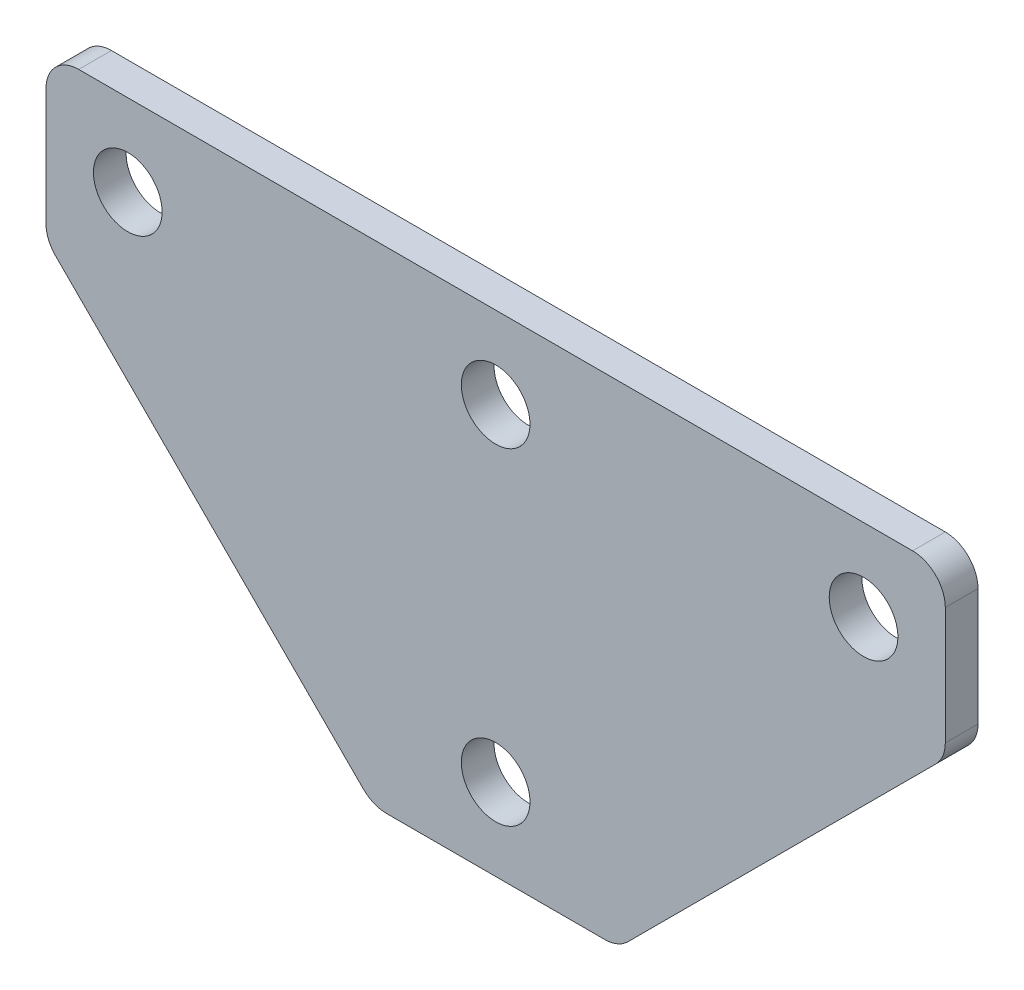
ISO-10303-21;
HEADER;
FILE_DESCRIPTION(('STEP AP214'),'2;1');
FILE_NAME('part.step','',(''),(''),'','','');
FILE_SCHEMA(('AUTOMOTIVE_DESIGN { 1 0 10303 214 1 1 1 1 }'));
ENDSEC;
DATA;
#1=APPLICATION_CONTEXT('core data for automotive mechanical design processes');
#2=APPLICATION_PROTOCOL_DEFINITION('international standard','automotive_design',2000,#1);
#3=PRODUCT_CONTEXT('',#1,'mechanical');
#4=PRODUCT('Part','Part','',(#3));
#5=PRODUCT_RELATED_PRODUCT_CATEGORY('part','',(#4));
#6=PRODUCT_DEFINITION_FORMATION('','',#4);
#7=PRODUCT_DEFINITION_CONTEXT('part definition',#1,'design');
#8=PRODUCT_DEFINITION('design','',#6,#7);
#9=PRODUCT_DEFINITION_SHAPE('','',#8);
#10=(LENGTH_UNIT() NAMED_UNIT(*) SI_UNIT(.MILLI.,.METRE.));
#11=(NAMED_UNIT(*) PLANE_ANGLE_UNIT() SI_UNIT($,.RADIAN.));
#12=(NAMED_UNIT(*) SI_UNIT($,.STERADIAN.) SOLID_ANGLE_UNIT());
#13=UNCERTAINTY_MEASURE_WITH_UNIT(LENGTH_MEASURE(1.E-05),#10,'distance_accuracy_value','');
#14=(GEOMETRIC_REPRESENTATION_CONTEXT(3) GLOBAL_UNCERTAINTY_ASSIGNED_CONTEXT((#13)) GLOBAL_UNIT_ASSIGNED_CONTEXT((#10,
#11,#12)) REPRESENTATION_CONTEXT('',''));
#15=CARTESIAN_POINT('',(0.,0.,0.));
#16=DIRECTION('',(0.,0.,1.));
#17=DIRECTION('',(1.,0.,0.));
#18=AXIS2_PLACEMENT_3D('',#15,#16,#17);
#19=CARTESIAN_POINT('',(0.,0.,2.));
#20=DIRECTION('',(0.,0.,1.));
#21=DIRECTION('',(1.,0.,0.));
#22=AXIS2_PLACEMENT_3D('',#19,#20,#21);
#23=PLANE('',#22);
#24=CARTESIAN_POINT('',(7.5,25.,2.));
#25=DIRECTION('',(0.,0.,1.));
#26=DIRECTION('',(1.,0.,0.));
#27=AXIS2_PLACEMENT_3D('',#24,#25,#26);
#28=CIRCLE('',#27,2.1);
#29=CARTESIAN_POINT('',(9.6,25.,2.));
#30=VERTEX_POINT('',#29);
#31=EDGE_CURVE('E250',#30,#30,#28,.T.);
#32=ORIENTED_EDGE('',*,*,#31,.F.);
#33=EDGE_LOOP('',(#32));
#34=FACE_BOUND('',#33,.T.);
#35=CARTESIAN_POINT('',(-15.,25.,2.));
#36=DIRECTION('',(0.,0.,1.));
#37=DIRECTION('',(1.,0.,0.));
#38=AXIS2_PLACEMENT_3D('',#35,#36,#37);
#39=CIRCLE('',#38,2.1);
#40=CARTESIAN_POINT('',(-12.9,25.,2.));
#41=VERTEX_POINT('',#40);
#42=EDGE_CURVE('E157',#41,#41,#39,.T.);
#43=ORIENTED_EDGE('',*,*,#42,.F.);
#44=EDGE_LOOP('',(#43));
#45=FACE_BOUND('',#44,.T.);
#46=DIRECTION('',(0.707106781186548,-0.707106781186547,0.));
#47=VECTOR('',#46,1.);
#48=CARTESIAN_POINT('',(-20.,20.,2.));
#49=LINE('',#48,#47);
#50=CARTESIAN_POINT('',(-19.4142135623731,19.4142135623731,2.));
#51=VERTEX_POINT('',#50);
#52=CARTESIAN_POINT('',(-0.585786437626905,0.585786437626905,2.));
#53=VERTEX_POINT('',#52);
#54=EDGE_CURVE('E168',#51,#53,#49,.T.);
#55=ORIENTED_EDGE('',*,*,#54,.T.);
#56=CARTESIAN_POINT('',(0.828427124746185,2.,2.));
#57=DIRECTION('',(0.,0.,1.));
#58=DIRECTION('',(1.,0.,0.));
#59=AXIS2_PLACEMENT_3D('',#56,#57,#58);
#60=CIRCLE('',#59,2.);
#61=CARTESIAN_POINT('',(0.828427124746185,0.,2.));
#62=VERTEX_POINT('',#61);
#63=EDGE_CURVE('E191',#53,#62,#60,.T.);
#64=ORIENTED_EDGE('',*,*,#63,.T.);
#65=DIRECTION('',(1.,0.,0.));
#66=VECTOR('',#65,1.);
#67=CARTESIAN_POINT('',(0.,0.,2.));
#68=LINE('',#67,#66);
#69=CARTESIAN_POINT('',(14.1715728752538,0.,2.));
#70=VERTEX_POINT('',#69);
#71=EDGE_CURVE('E144',#62,#70,#68,.T.);
#72=ORIENTED_EDGE('',*,*,#71,.T.);
#73=CARTESIAN_POINT('',(14.1715728752538,2.,2.));
#74=DIRECTION('',(0.,0.,1.));
#75=DIRECTION('',(1.,0.,0.));
#76=AXIS2_PLACEMENT_3D('',#73,#74,#75);
#77=CIRCLE('',#76,2.);
#78=CARTESIAN_POINT('',(15.5857864376269,0.585786437626906,2.));
#79=VERTEX_POINT('',#78);
#80=EDGE_CURVE('E189',#70,#79,#77,.T.);
#81=ORIENTED_EDGE('',*,*,#80,.T.);
#82=DIRECTION('',(0.707106781186548,0.707106781186547,0.));
#83=VECTOR('',#82,1.);
#84=CARTESIAN_POINT('',(15.,0.,2.));
#85=LINE('',#84,#83);
#86=CARTESIAN_POINT('',(34.4142135623731,19.4142135623731,2.));
#87=VERTEX_POINT('',#86);
#88=EDGE_CURVE('E222',#79,#87,#85,.T.);
#89=ORIENTED_EDGE('',*,*,#88,.T.);
#90=CARTESIAN_POINT('',(33.,20.8284271247462,2.));
#91=DIRECTION('',(0.,0.,1.));
#92=DIRECTION('',(1.,0.,0.));
#93=AXIS2_PLACEMENT_3D('',#90,#91,#92);
#94=CIRCLE('',#93,2.);
#95=CARTESIAN_POINT('',(35.,20.8284271247462,2.));
#96=VERTEX_POINT('',#95);
#97=EDGE_CURVE('E187',#87,#96,#94,.T.);
#98=ORIENTED_EDGE('',*,*,#97,.T.);
#99=DIRECTION('',(0.,1.,0.));
#100=VECTOR('',#99,1.);
#101=CARTESIAN_POINT('',(35.,20.,2.));
#102=LINE('',#101,#100);
#103=CARTESIAN_POINT('',(35.,28.,2.));
#104=VERTEX_POINT('',#103);
#105=EDGE_CURVE('E230',#96,#104,#102,.T.);
#106=ORIENTED_EDGE('',*,*,#105,.T.);
#107=CARTESIAN_POINT('',(33.,28.,2.));
#108=DIRECTION('',(0.,0.,1.));
#109=DIRECTION('',(1.,0.,0.));
#110=AXIS2_PLACEMENT_3D('',#107,#108,#109);
#111=CIRCLE('',#110,2.);
#112=CARTESIAN_POINT('',(33.,30.,2.));
#113=VERTEX_POINT('',#112);
#114=EDGE_CURVE('E185',#104,#113,#111,.T.);
#115=ORIENTED_EDGE('',*,*,#114,.T.);
#116=DIRECTION('',(-1.,0.,0.));
#117=VECTOR('',#116,1.);
#118=CARTESIAN_POINT('',(35.,30.,2.));
#119=LINE('',#118,#117);
#120=CARTESIAN_POINT('',(-18.,30.,2.));
#121=VERTEX_POINT('',#120);
#122=EDGE_CURVE('E233',#113,#121,#119,.T.);
#123=ORIENTED_EDGE('',*,*,#122,.T.);
#124=CARTESIAN_POINT('',(-18.,28.,2.));
#125=DIRECTION('',(0.,0.,1.));
#126=DIRECTION('',(1.,0.,0.));
#127=AXIS2_PLACEMENT_3D('',#124,#125,#126);
#128=CIRCLE('',#127,2.);
#129=CARTESIAN_POINT('',(-20.,28.,2.));
#130=VERTEX_POINT('',#129);
#131=EDGE_CURVE('E55',#121,#130,#128,.T.);
#132=ORIENTED_EDGE('',*,*,#131,.T.);
#133=DIRECTION('',(0.,-1.,0.));
#134=VECTOR('',#133,1.);
#135=CARTESIAN_POINT('',(-20.,30.,2.));
#136=LINE('',#135,#134);
#137=CARTESIAN_POINT('',(-20.,20.8284271247462,2.));
#138=VERTEX_POINT('',#137);
#139=EDGE_CURVE('E169',#130,#138,#136,.T.);
#140=ORIENTED_EDGE('',*,*,#139,.T.);
#141=CARTESIAN_POINT('',(-18.,20.8284271247462,2.));
#142=DIRECTION('',(0.,0.,1.));
#143=DIRECTION('',(1.,0.,0.));
#144=AXIS2_PLACEMENT_3D('',#141,#142,#143);
#145=CIRCLE('',#144,2.);
#146=EDGE_CURVE('E183',#138,#51,#145,.T.);
#147=ORIENTED_EDGE('',*,*,#146,.T.);
#148=EDGE_LOOP('',(#55,#64,#72,#81,#89,#98,#106,#115,#123,#132,#140,#147));
#149=FACE_BOUND('',#148,.T.);
#150=CARTESIAN_POINT('',(30.,25.,2.));
#151=DIRECTION('',(0.,0.,1.));
#152=DIRECTION('',(-1.,0.,0.));
#153=AXIS2_PLACEMENT_3D('',#150,#151,#152);
#154=CIRCLE('',#153,2.1);
#155=CARTESIAN_POINT('',(27.9,25.,2.));
#156=VERTEX_POINT('',#155);
#157=EDGE_CURVE('E241',#156,#156,#154,.T.);
#158=ORIENTED_EDGE('',*,*,#157,.F.);
#159=EDGE_LOOP('',(#158));
#160=FACE_BOUND('',#159,.T.);
#161=CARTESIAN_POINT('',(7.5,5.,2.));
#162=DIRECTION('',(0.,0.,1.));
#163=DIRECTION('',(1.,0.,0.));
#164=AXIS2_PLACEMENT_3D('',#161,#162,#163);
#165=CIRCLE('',#164,2.1);
#166=CARTESIAN_POINT('',(9.6,5.,2.));
#167=VERTEX_POINT('',#166);
#168=EDGE_CURVE('E244',#167,#167,#165,.T.);
#169=ORIENTED_EDGE('',*,*,#168,.F.);
#170=EDGE_LOOP('',(#169));
#171=FACE_BOUND('',#170,.T.);
#172=ADVANCED_FACE('F35',(#34,#45,#149,#160,#171),#23,.T.);
#173=CARTESIAN_POINT('',(0.,0.,0.));
#174=DIRECTION('',(0.,0.,1.));
#175=DIRECTION('',(1.,0.,0.));
#176=AXIS2_PLACEMENT_3D('',#173,#174,#175);
#177=PLANE('',#176);
#178=DIRECTION('',(1.,0.,0.));
#179=VECTOR('',#178,1.);
#180=CARTESIAN_POINT('',(0.,0.,0.));
#181=LINE('',#180,#179);
#182=CARTESIAN_POINT('',(0.828427124746185,0.,0.));
#183=VERTEX_POINT('',#182);
#184=CARTESIAN_POINT('',(14.1715728752538,0.,0.));
#185=VERTEX_POINT('',#184);
#186=EDGE_CURVE('E141',#183,#185,#181,.T.);
#187=ORIENTED_EDGE('',*,*,#186,.F.);
#188=CARTESIAN_POINT('',(0.828427124746185,2.,0.));
#189=DIRECTION('',(0.,0.,1.));
#190=DIRECTION('',(1.,0.,0.));
#191=AXIS2_PLACEMENT_3D('',#188,#189,#190);
#192=CIRCLE('',#191,2.);
#193=CARTESIAN_POINT('',(-0.585786437626905,0.585786437626905,0.));
#194=VERTEX_POINT('',#193);
#195=EDGE_CURVE('E124',#183,#194,#192,.F.);
#196=ORIENTED_EDGE('',*,*,#195,.T.);
#197=DIRECTION('',(0.707106781186548,-0.707106781186547,0.));
#198=VECTOR('',#197,1.);
#199=CARTESIAN_POINT('',(-20.,20.,0.));
#200=LINE('',#199,#198);
#201=CARTESIAN_POINT('',(-19.4142135623731,19.4142135623731,0.));
#202=VERTEX_POINT('',#201);
#203=EDGE_CURVE('E152',#202,#194,#200,.T.);
#204=ORIENTED_EDGE('',*,*,#203,.F.);
#205=CARTESIAN_POINT('',(-18.,20.8284271247462,0.));
#206=DIRECTION('',(0.,0.,1.));
#207=DIRECTION('',(1.,0.,0.));
#208=AXIS2_PLACEMENT_3D('',#205,#206,#207);
#209=CIRCLE('',#208,2.);
#210=CARTESIAN_POINT('',(-20.,20.8284271247462,0.));
#211=VERTEX_POINT('',#210);
#212=EDGE_CURVE('E172',#202,#211,#209,.F.);
#213=ORIENTED_EDGE('',*,*,#212,.T.);
#214=DIRECTION('',(0.,-1.,0.));
#215=VECTOR('',#214,1.);
#216=CARTESIAN_POINT('',(-20.,30.,0.));
#217=LINE('',#216,#215);
#218=CARTESIAN_POINT('',(-20.,28.,0.));
#219=VERTEX_POINT('',#218);
#220=EDGE_CURVE('E166',#219,#211,#217,.T.);
#221=ORIENTED_EDGE('',*,*,#220,.F.);
#222=CARTESIAN_POINT('',(-18.,28.,0.));
#223=DIRECTION('',(0.,0.,1.));
#224=DIRECTION('',(1.,0.,0.));
#225=AXIS2_PLACEMENT_3D('',#222,#223,#224);
#226=CIRCLE('',#225,2.);
#227=CARTESIAN_POINT('',(-18.,30.,0.));
#228=VERTEX_POINT('',#227);
#229=EDGE_CURVE('E145',#219,#228,#226,.F.);
#230=ORIENTED_EDGE('',*,*,#229,.T.);
#231=DIRECTION('',(-1.,0.,0.));
#232=VECTOR('',#231,1.);
#233=CARTESIAN_POINT('',(35.,30.,0.));
#234=LINE('',#233,#232);
#235=CARTESIAN_POINT('',(33.,30.,0.));
#236=VERTEX_POINT('',#235);
#237=EDGE_CURVE('E163',#236,#228,#234,.T.);
#238=ORIENTED_EDGE('',*,*,#237,.F.);
#239=CARTESIAN_POINT('',(33.,28.,0.));
#240=DIRECTION('',(0.,0.,1.));
#241=DIRECTION('',(1.,0.,0.));
#242=AXIS2_PLACEMENT_3D('',#239,#240,#241);
#243=CIRCLE('',#242,2.);
#244=CARTESIAN_POINT('',(35.,28.,0.));
#245=VERTEX_POINT('',#244);
#246=EDGE_CURVE('E174',#236,#245,#243,.F.);
#247=ORIENTED_EDGE('',*,*,#246,.T.);
#248=DIRECTION('',(0.,1.,0.));
#249=VECTOR('',#248,1.);
#250=CARTESIAN_POINT('',(35.,20.,0.));
#251=LINE('',#250,#249);
#252=CARTESIAN_POINT('',(35.,20.8284271247462,0.));
#253=VERTEX_POINT('',#252);
#254=EDGE_CURVE('E155',#253,#245,#251,.T.);
#255=ORIENTED_EDGE('',*,*,#254,.F.);
#256=CARTESIAN_POINT('',(33.,20.8284271247462,0.));
#257=DIRECTION('',(0.,0.,1.));
#258=DIRECTION('',(1.,0.,0.));
#259=AXIS2_PLACEMENT_3D('',#256,#257,#258);
#260=CIRCLE('',#259,2.);
#261=CARTESIAN_POINT('',(34.4142135623731,19.4142135623731,0.));
#262=VERTEX_POINT('',#261);
#263=EDGE_CURVE('E176',#253,#262,#260,.F.);
#264=ORIENTED_EDGE('',*,*,#263,.T.);
#265=DIRECTION('',(0.707106781186548,0.707106781186547,0.));
#266=VECTOR('',#265,1.);
#267=CARTESIAN_POINT('',(15.,0.,0.));
#268=LINE('',#267,#266);
#269=CARTESIAN_POINT('',(15.5857864376269,0.585786437626906,0.));
#270=VERTEX_POINT('',#269);
#271=EDGE_CURVE('E151',#270,#262,#268,.T.);
#272=ORIENTED_EDGE('',*,*,#271,.F.);
#273=CARTESIAN_POINT('',(14.1715728752538,2.,0.));
#274=DIRECTION('',(0.,0.,1.));
#275=DIRECTION('',(1.,0.,0.));
#276=AXIS2_PLACEMENT_3D('',#273,#274,#275);
#277=CIRCLE('',#276,2.);
#278=EDGE_CURVE('E135',#270,#185,#277,.F.);
#279=ORIENTED_EDGE('',*,*,#278,.T.);
#280=EDGE_LOOP('',(#187,#196,#204,#213,#221,#230,#238,#247,#255,#264,#272,#279));
#281=FACE_BOUND('',#280,.T.);
#282=CARTESIAN_POINT('',(-15.,25.,0.));
#283=DIRECTION('',(0.,0.,1.));
#284=DIRECTION('',(1.,0.,0.));
#285=AXIS2_PLACEMENT_3D('',#282,#283,#284);
#286=CIRCLE('',#285,2.1);
#287=CARTESIAN_POINT('',(-12.9,25.,0.));
#288=VERTEX_POINT('',#287);
#289=EDGE_CURVE('E225',#288,#288,#286,.T.);
#290=ORIENTED_EDGE('',*,*,#289,.T.);
#291=EDGE_LOOP('',(#290));
#292=FACE_BOUND('',#291,.T.);
#293=CARTESIAN_POINT('',(30.,25.,0.));
#294=DIRECTION('',(0.,0.,1.));
#295=DIRECTION('',(-1.,0.,0.));
#296=AXIS2_PLACEMENT_3D('',#293,#294,#295);
#297=CIRCLE('',#296,2.1);
#298=CARTESIAN_POINT('',(27.9,25.,0.));
#299=VERTEX_POINT('',#298);
#300=EDGE_CURVE('E256',#299,#299,#297,.T.);
#301=ORIENTED_EDGE('',*,*,#300,.T.);
#302=EDGE_LOOP('',(#301));
#303=FACE_BOUND('',#302,.T.);
#304=CARTESIAN_POINT('',(7.5,25.,0.));
#305=DIRECTION('',(0.,0.,1.));
#306=DIRECTION('',(1.,0.,0.));
#307=AXIS2_PLACEMENT_3D('',#304,#305,#306);
#308=CIRCLE('',#307,2.1);
#309=CARTESIAN_POINT('',(9.6,25.,0.));
#310=VERTEX_POINT('',#309);
#311=EDGE_CURVE('E246',#310,#310,#308,.T.);
#312=ORIENTED_EDGE('',*,*,#311,.T.);
#313=EDGE_LOOP('',(#312));
#314=FACE_BOUND('',#313,.T.);
#315=CARTESIAN_POINT('',(7.5,5.,0.));
#316=DIRECTION('',(0.,0.,1.));
#317=DIRECTION('',(1.,0.,0.));
#318=AXIS2_PLACEMENT_3D('',#315,#316,#317);
#319=CIRCLE('',#318,2.1);
#320=CARTESIAN_POINT('',(9.6,5.,0.));
#321=VERTEX_POINT('',#320);
#322=EDGE_CURVE('E247',#321,#321,#319,.T.);
#323=ORIENTED_EDGE('',*,*,#322,.T.);
#324=EDGE_LOOP('',(#323));
#325=FACE_BOUND('',#324,.T.);
#326=ADVANCED_FACE('F148',(#281,#292,#303,#314,#325),#177,.F.);
#327=CARTESIAN_POINT('',(-20.,20.,2.));
#328=DIRECTION('',(0.707106781186547,0.707106781186548,0.));
#329=DIRECTION('',(-0.707106781186548,0.707106781186547,0.));
#330=AXIS2_PLACEMENT_3D('',#327,#328,#329);
#331=PLANE('',#330);
#332=ORIENTED_EDGE('',*,*,#203,.T.);
#333=DIRECTION('',(0.,0.,-1.));
#334=VECTOR('',#333,1.);
#335=CARTESIAN_POINT('',(-0.585786437626905,0.585786437626905,2.));
#336=LINE('',#335,#334);
#337=EDGE_CURVE('E129',#194,#53,#336,.F.);
#338=ORIENTED_EDGE('',*,*,#337,.T.);
#339=ORIENTED_EDGE('',*,*,#54,.F.);
#340=DIRECTION('',(0.,0.,-1.));
#341=VECTOR('',#340,1.);
#342=CARTESIAN_POINT('',(-19.4142135623731,19.4142135623731,2.));
#343=LINE('',#342,#341);
#344=EDGE_CURVE('E134',#51,#202,#343,.T.);
#345=ORIENTED_EDGE('',*,*,#344,.T.);
#346=EDGE_LOOP('',(#332,#338,#339,#345));
#347=FACE_BOUND('',#346,.T.);
#348=ADVANCED_FACE('F219',(#347),#331,.F.);
#349=CARTESIAN_POINT('',(0.,0.,2.));
#350=DIRECTION('',(0.,1.,0.));
#351=DIRECTION('',(-1.,0.,0.));
#352=AXIS2_PLACEMENT_3D('',#349,#350,#351);
#353=PLANE('',#352);
#354=ORIENTED_EDGE('',*,*,#71,.F.);
#355=DIRECTION('',(0.,0.,-1.));
#356=VECTOR('',#355,1.);
#357=CARTESIAN_POINT('',(0.828427124746185,0.,2.));
#358=LINE('',#357,#356);
#359=EDGE_CURVE('E128',#62,#183,#358,.T.);
#360=ORIENTED_EDGE('',*,*,#359,.T.);
#361=ORIENTED_EDGE('',*,*,#186,.T.);
#362=DIRECTION('',(0.,0.,-1.));
#363=VECTOR('',#362,1.);
#364=CARTESIAN_POINT('',(14.1715728752538,0.,2.));
#365=LINE('',#364,#363);
#366=EDGE_CURVE('E146',#185,#70,#365,.F.);
#367=ORIENTED_EDGE('',*,*,#366,.T.);
#368=EDGE_LOOP('',(#354,#360,#361,#367));
#369=FACE_BOUND('',#368,.T.);
#370=ADVANCED_FACE('F140',(#369),#353,.F.);
#371=CARTESIAN_POINT('',(15.,0.,2.));
#372=DIRECTION('',(-0.707106781186547,0.707106781186548,0.));
#373=DIRECTION('',(-0.707106781186548,-0.707106781186547,0.));
#374=AXIS2_PLACEMENT_3D('',#371,#372,#373);
#375=PLANE('',#374);
#376=ORIENTED_EDGE('',*,*,#88,.F.);
#377=DIRECTION('',(0.,0.,-1.));
#378=VECTOR('',#377,1.);
#379=CARTESIAN_POINT('',(15.5857864376269,0.585786437626906,2.));
#380=LINE('',#379,#378);
#381=EDGE_CURVE('E195',#79,#270,#380,.T.);
#382=ORIENTED_EDGE('',*,*,#381,.T.);
#383=ORIENTED_EDGE('',*,*,#271,.T.);
#384=DIRECTION('',(0.,0.,-1.));
#385=VECTOR('',#384,1.);
#386=CARTESIAN_POINT('',(34.4142135623731,19.4142135623731,2.));
#387=LINE('',#386,#385);
#388=EDGE_CURVE('E193',#262,#87,#387,.F.);
#389=ORIENTED_EDGE('',*,*,#388,.T.);
#390=EDGE_LOOP('',(#376,#382,#383,#389));
#391=FACE_BOUND('',#390,.T.);
#392=ADVANCED_FACE('F290',(#391),#375,.F.);
#393=CARTESIAN_POINT('',(35.,20.,2.));
#394=DIRECTION('',(-1.,0.,0.));
#395=DIRECTION('',(0.,-1.,0.));
#396=AXIS2_PLACEMENT_3D('',#393,#394,#395);
#397=PLANE('',#396);
#398=ORIENTED_EDGE('',*,*,#105,.F.);
#399=DIRECTION('',(0.,0.,-1.));
#400=VECTOR('',#399,1.);
#401=CARTESIAN_POINT('',(35.,20.8284271247462,2.));
#402=LINE('',#401,#400);
#403=EDGE_CURVE('E200',#96,#253,#402,.T.);
#404=ORIENTED_EDGE('',*,*,#403,.T.);
#405=ORIENTED_EDGE('',*,*,#254,.T.);
#406=DIRECTION('',(0.,0.,-1.));
#407=VECTOR('',#406,1.);
#408=CARTESIAN_POINT('',(35.,28.,2.));
#409=LINE('',#408,#407);
#410=EDGE_CURVE('E198',#245,#104,#409,.F.);
#411=ORIENTED_EDGE('',*,*,#410,.T.);
#412=EDGE_LOOP('',(#398,#404,#405,#411));
#413=FACE_BOUND('',#412,.T.);
#414=ADVANCED_FACE('F286',(#413),#397,.F.);
#415=CARTESIAN_POINT('',(35.,30.,2.));
#416=DIRECTION('',(0.,-1.,0.));
#417=DIRECTION('',(1.,0.,0.));
#418=AXIS2_PLACEMENT_3D('',#415,#416,#417);
#419=PLANE('',#418);
#420=ORIENTED_EDGE('',*,*,#122,.F.);
#421=DIRECTION('',(0.,0.,-1.));
#422=VECTOR('',#421,1.);
#423=CARTESIAN_POINT('',(33.,30.,2.));
#424=LINE('',#423,#422);
#425=EDGE_CURVE('E205',#113,#236,#424,.T.);
#426=ORIENTED_EDGE('',*,*,#425,.T.);
#427=ORIENTED_EDGE('',*,*,#237,.T.);
#428=DIRECTION('',(0.,0.,-1.));
#429=VECTOR('',#428,1.);
#430=CARTESIAN_POINT('',(-18.,30.,2.));
#431=LINE('',#430,#429);
#432=EDGE_CURVE('E203',#228,#121,#431,.F.);
#433=ORIENTED_EDGE('',*,*,#432,.T.);
#434=EDGE_LOOP('',(#420,#426,#427,#433));
#435=FACE_BOUND('',#434,.T.);
#436=ADVANCED_FACE('F278',(#435),#419,.F.);
#437=CARTESIAN_POINT('',(-20.,30.,2.));
#438=DIRECTION('',(1.,0.,0.));
#439=DIRECTION('',(0.,1.,0.));
#440=AXIS2_PLACEMENT_3D('',#437,#438,#439);
#441=PLANE('',#440);
#442=ORIENTED_EDGE('',*,*,#220,.T.);
#443=DIRECTION('',(0.,0.,-1.));
#444=VECTOR('',#443,1.);
#445=CARTESIAN_POINT('',(-20.,20.8284271247462,2.));
#446=LINE('',#445,#444);
#447=EDGE_CURVE('E11',#211,#138,#446,.F.);
#448=ORIENTED_EDGE('',*,*,#447,.T.);
#449=ORIENTED_EDGE('',*,*,#139,.F.);
#450=DIRECTION('',(0.,0.,-1.));
#451=VECTOR('',#450,1.);
#452=CARTESIAN_POINT('',(-20.,28.,2.));
#453=LINE('',#452,#451);
#454=EDGE_CURVE('E43',#130,#219,#453,.T.);
#455=ORIENTED_EDGE('',*,*,#454,.T.);
#456=EDGE_LOOP('',(#442,#448,#449,#455));
#457=FACE_BOUND('',#456,.T.);
#458=ADVANCED_FACE('F210',(#457),#441,.F.);
#459=CARTESIAN_POINT('',(-15.,25.,2.));
#460=DIRECTION('',(0.,0.,-1.));
#461=DIRECTION('',(-1.,0.,0.));
#462=AXIS2_PLACEMENT_3D('',#459,#460,#461);
#463=CYLINDRICAL_SURFACE('',#462,2.1);
#464=ORIENTED_EDGE('',*,*,#42,.T.);
#465=EDGE_LOOP('',(#464));
#466=FACE_BOUND('',#465,.T.);
#467=ORIENTED_EDGE('',*,*,#289,.F.);
#468=EDGE_LOOP('',(#467));
#469=FACE_BOUND('',#468,.T.);
#470=ADVANCED_FACE('F267',(#466,#469),#463,.F.);
#471=CARTESIAN_POINT('',(30.,25.,2.));
#472=DIRECTION('',(0.,0.,-1.));
#473=DIRECTION('',(-1.,0.,0.));
#474=AXIS2_PLACEMENT_3D('',#471,#472,#473);
#475=CYLINDRICAL_SURFACE('',#474,2.1);
#476=ORIENTED_EDGE('',*,*,#157,.T.);
#477=EDGE_LOOP('',(#476));
#478=FACE_BOUND('',#477,.T.);
#479=ORIENTED_EDGE('',*,*,#300,.F.);
#480=EDGE_LOOP('',(#479));
#481=FACE_BOUND('',#480,.T.);
#482=ADVANCED_FACE('F269',(#478,#481),#475,.F.);
#483=CARTESIAN_POINT('',(7.5,25.,2.));
#484=DIRECTION('',(0.,0.,-1.));
#485=DIRECTION('',(-1.,0.,0.));
#486=AXIS2_PLACEMENT_3D('',#483,#484,#485);
#487=CYLINDRICAL_SURFACE('',#486,2.1);
#488=ORIENTED_EDGE('',*,*,#31,.T.);
#489=EDGE_LOOP('',(#488));
#490=FACE_BOUND('',#489,.T.);
#491=ORIENTED_EDGE('',*,*,#311,.F.);
#492=EDGE_LOOP('',(#491));
#493=FACE_BOUND('',#492,.T.);
#494=ADVANCED_FACE('F275',(#490,#493),#487,.F.);
#495=CARTESIAN_POINT('',(7.5,5.,2.));
#496=DIRECTION('',(0.,0.,-1.));
#497=DIRECTION('',(-1.,0.,0.));
#498=AXIS2_PLACEMENT_3D('',#495,#496,#497);
#499=CYLINDRICAL_SURFACE('',#498,2.1);
#500=ORIENTED_EDGE('',*,*,#168,.T.);
#501=EDGE_LOOP('',(#500));
#502=FACE_BOUND('',#501,.T.);
#503=ORIENTED_EDGE('',*,*,#322,.F.);
#504=EDGE_LOOP('',(#503));
#505=FACE_BOUND('',#504,.T.);
#506=ADVANCED_FACE('F302',(#502,#505),#499,.F.);
#507=CARTESIAN_POINT('',(0.828427124746185,2.,2.));
#508=DIRECTION('',(0.,0.,-1.));
#509=DIRECTION('',(-1.,0.,0.));
#510=AXIS2_PLACEMENT_3D('',#507,#508,#509);
#511=CYLINDRICAL_SURFACE('',#510,2.);
#512=ORIENTED_EDGE('',*,*,#63,.F.);
#513=ORIENTED_EDGE('',*,*,#337,.F.);
#514=ORIENTED_EDGE('',*,*,#195,.F.);
#515=ORIENTED_EDGE('',*,*,#359,.F.);
#516=EDGE_LOOP('',(#512,#513,#514,#515));
#517=FACE_BOUND('',#516,.T.);
#518=ADVANCED_FACE('F127',(#517),#511,.T.);
#519=CARTESIAN_POINT('',(14.1715728752538,2.,2.));
#520=DIRECTION('',(0.,0.,-1.));
#521=DIRECTION('',(-1.,0.,0.));
#522=AXIS2_PLACEMENT_3D('',#519,#520,#521);
#523=CYLINDRICAL_SURFACE('',#522,2.);
#524=ORIENTED_EDGE('',*,*,#80,.F.);
#525=ORIENTED_EDGE('',*,*,#366,.F.);
#526=ORIENTED_EDGE('',*,*,#278,.F.);
#527=ORIENTED_EDGE('',*,*,#381,.F.);
#528=EDGE_LOOP('',(#524,#525,#526,#527));
#529=FACE_BOUND('',#528,.T.);
#530=ADVANCED_FACE('F301',(#529),#523,.T.);
#531=CARTESIAN_POINT('',(33.,20.8284271247462,2.));
#532=DIRECTION('',(0.,0.,-1.));
#533=DIRECTION('',(-1.,0.,0.));
#534=AXIS2_PLACEMENT_3D('',#531,#532,#533);
#535=CYLINDRICAL_SURFACE('',#534,2.);
#536=ORIENTED_EDGE('',*,*,#97,.F.);
#537=ORIENTED_EDGE('',*,*,#388,.F.);
#538=ORIENTED_EDGE('',*,*,#263,.F.);
#539=ORIENTED_EDGE('',*,*,#403,.F.);
#540=EDGE_LOOP('',(#536,#537,#538,#539));
#541=FACE_BOUND('',#540,.T.);
#542=ADVANCED_FACE('F305',(#541),#535,.T.);
#543=CARTESIAN_POINT('',(33.,28.,2.));
#544=DIRECTION('',(0.,0.,-1.));
#545=DIRECTION('',(-1.,0.,0.));
#546=AXIS2_PLACEMENT_3D('',#543,#544,#545);
#547=CYLINDRICAL_SURFACE('',#546,2.);
#548=ORIENTED_EDGE('',*,*,#114,.F.);
#549=ORIENTED_EDGE('',*,*,#410,.F.);
#550=ORIENTED_EDGE('',*,*,#246,.F.);
#551=ORIENTED_EDGE('',*,*,#425,.F.);
#552=EDGE_LOOP('',(#548,#549,#550,#551));
#553=FACE_BOUND('',#552,.T.);
#554=ADVANCED_FACE('F309',(#553),#547,.T.);
#555=CARTESIAN_POINT('',(-18.,20.8284271247462,2.));
#556=DIRECTION('',(0.,0.,-1.));
#557=DIRECTION('',(-1.,0.,0.));
#558=AXIS2_PLACEMENT_3D('',#555,#556,#557);
#559=CYLINDRICAL_SURFACE('',#558,2.);
#560=ORIENTED_EDGE('',*,*,#146,.F.);
#561=ORIENTED_EDGE('',*,*,#447,.F.);
#562=ORIENTED_EDGE('',*,*,#212,.F.);
#563=ORIENTED_EDGE('',*,*,#344,.F.);
#564=EDGE_LOOP('',(#560,#561,#562,#563));
#565=FACE_BOUND('',#564,.T.);
#566=ADVANCED_FACE('F216',(#565),#559,.T.);
#567=CARTESIAN_POINT('',(-18.,28.,2.));
#568=DIRECTION('',(0.,0.,-1.));
#569=DIRECTION('',(-1.,0.,0.));
#570=AXIS2_PLACEMENT_3D('',#567,#568,#569);
#571=CYLINDRICAL_SURFACE('',#570,2.);
#572=ORIENTED_EDGE('',*,*,#131,.F.);
#573=ORIENTED_EDGE('',*,*,#432,.F.);
#574=ORIENTED_EDGE('',*,*,#229,.F.);
#575=ORIENTED_EDGE('',*,*,#454,.F.);
#576=EDGE_LOOP('',(#572,#573,#574,#575));
#577=FACE_BOUND('',#576,.T.);
#578=ADVANCED_FACE('F37',(#577),#571,.T.);
#579=CLOSED_SHELL('',(#172,#326,#348,#370,#392,#414,#436,#458,#470,#482,#494,#506,#518,#530,
#542,#554,#566,#578));
#580=MANIFOLD_SOLID_BREP('B2',#579);
#581=ADVANCED_BREP_SHAPE_REPRESENTATION('',(#18,#580),#14);
#582=SHAPE_DEFINITION_REPRESENTATION(#9,#581);
ENDSEC;
END-ISO-10303-21;
